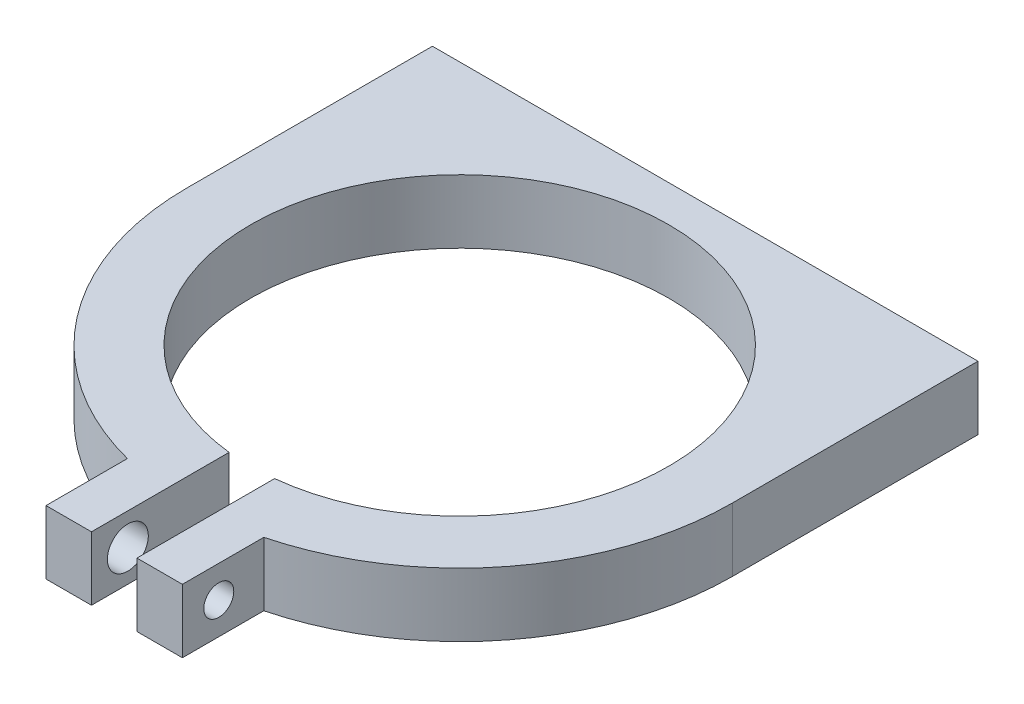
ISO-10303-21;
HEADER;
FILE_DESCRIPTION(('STEP AP214'),'2;1');
FILE_NAME('part.step','',(''),(''),'','','');
FILE_SCHEMA(('AUTOMOTIVE_DESIGN { 1 0 10303 214 1 1 1 1 }'));
ENDSEC;
DATA;
#1=APPLICATION_CONTEXT('core data for automotive mechanical design processes');
#2=APPLICATION_PROTOCOL_DEFINITION('international standard','automotive_design',2000,#1);
#3=PRODUCT_CONTEXT('',#1,'mechanical');
#4=PRODUCT('Part','Part','',(#3));
#5=PRODUCT_RELATED_PRODUCT_CATEGORY('part','',(#4));
#6=PRODUCT_DEFINITION_FORMATION('','',#4);
#7=PRODUCT_DEFINITION_CONTEXT('part definition',#1,'design');
#8=PRODUCT_DEFINITION('design','',#6,#7);
#9=PRODUCT_DEFINITION_SHAPE('','',#8);
#10=(LENGTH_UNIT() NAMED_UNIT(*) SI_UNIT(.MILLI.,.METRE.));
#11=(NAMED_UNIT(*) PLANE_ANGLE_UNIT() SI_UNIT($,.RADIAN.));
#12=(NAMED_UNIT(*) SI_UNIT($,.STERADIAN.) SOLID_ANGLE_UNIT());
#13=UNCERTAINTY_MEASURE_WITH_UNIT(LENGTH_MEASURE(1.E-05),#10,'distance_accuracy_value','');
#14=(GEOMETRIC_REPRESENTATION_CONTEXT(3) GLOBAL_UNCERTAINTY_ASSIGNED_CONTEXT((#13)) GLOBAL_UNIT_ASSIGNED_CONTEXT((#10,
#11,#12)) REPRESENTATION_CONTEXT('',''));
#15=CARTESIAN_POINT('',(0.,0.,0.));
#16=DIRECTION('',(0.,0.,1.));
#17=DIRECTION('',(1.,0.,0.));
#18=AXIS2_PLACEMENT_3D('',#15,#16,#17);
#19=CARTESIAN_POINT('',(0.,3.5,0.));
#20=DIRECTION('',(0.,-1.,0.));
#21=DIRECTION('',(0.,0.,-1.));
#22=AXIS2_PLACEMENT_3D('',#19,#20,#21);
#23=CYLINDRICAL_SURFACE('',#22,30.);
#24=CARTESIAN_POINT('',(0.,-3.5,0.));
#25=DIRECTION('',(0.,1.,0.));
#26=DIRECTION('',(0.,0.,1.));
#27=AXIS2_PLACEMENT_3D('',#24,#25,#26);
#28=CIRCLE('',#27,30.);
#29=CARTESIAN_POINT('',(-30.,-3.5,0.));
#30=VERTEX_POINT('',#29);
#31=CARTESIAN_POINT('',(-7.5,-3.5,29.0473750965556));
#32=VERTEX_POINT('',#31);
#33=EDGE_CURVE('E165',#30,#32,#28,.T.);
#34=ORIENTED_EDGE('',*,*,#33,.T.);
#35=DIRECTION('',(0.,-1.,0.));
#36=VECTOR('',#35,1.);
#37=CARTESIAN_POINT('',(-7.5,3.5,29.0473750965556));
#38=LINE('',#37,#36);
#39=CARTESIAN_POINT('',(-7.5,3.5,29.0473750965556));
#40=VERTEX_POINT('',#39);
#41=EDGE_CURVE('E11',#40,#32,#38,.T.);
#42=ORIENTED_EDGE('',*,*,#41,.F.);
#43=CARTESIAN_POINT('',(0.,3.5,0.));
#44=DIRECTION('',(0.,1.,0.));
#45=DIRECTION('',(0.,0.,1.));
#46=AXIS2_PLACEMENT_3D('',#43,#44,#45);
#47=CIRCLE('',#46,30.);
#48=CARTESIAN_POINT('',(-30.,3.5,0.));
#49=VERTEX_POINT('',#48);
#50=EDGE_CURVE('E188',#49,#40,#47,.T.);
#51=ORIENTED_EDGE('',*,*,#50,.F.);
#52=DIRECTION('',(0.,-1.,0.));
#53=VECTOR('',#52,1.);
#54=CARTESIAN_POINT('',(-30.,3.5,0.));
#55=LINE('',#54,#53);
#56=EDGE_CURVE('E161',#49,#30,#55,.T.);
#57=ORIENTED_EDGE('',*,*,#56,.T.);
#58=EDGE_LOOP('',(#34,#42,#51,#57));
#59=FACE_BOUND('',#58,.T.);
#60=ADVANCED_FACE('F42',(#59),#23,.T.);
#61=CARTESIAN_POINT('',(-7.5,3.5,38.));
#62=DIRECTION('',(1.,0.,0.));
#63=DIRECTION('',(0.,0.,-1.));
#64=AXIS2_PLACEMENT_3D('',#61,#62,#63);
#65=PLANE('',#64);
#66=CARTESIAN_POINT('',(-7.49999999999999,0.,34.));
#67=DIRECTION('',(-1.,0.,0.));
#68=DIRECTION('',(0.,0.,1.));
#69=AXIS2_PLACEMENT_3D('',#66,#67,#68);
#70=CIRCLE('',#69,2.25);
#71=CARTESIAN_POINT('',(-7.49999999999999,0.,36.25));
#72=VERTEX_POINT('',#71);
#73=EDGE_CURVE('E443',#72,#72,#70,.T.);
#74=ORIENTED_EDGE('',*,*,#73,.F.);
#75=EDGE_LOOP('',(#74));
#76=FACE_BOUND('',#75,.T.);
#77=DIRECTION('',(0.,0.,1.));
#78=VECTOR('',#77,1.);
#79=CARTESIAN_POINT('',(-7.5,-3.5,38.));
#80=LINE('',#79,#78);
#81=CARTESIAN_POINT('',(-7.5,-3.5,38.));
#82=VERTEX_POINT('',#81);
#83=EDGE_CURVE('E168',#32,#82,#80,.T.);
#84=ORIENTED_EDGE('',*,*,#83,.T.);
#85=DIRECTION('',(0.,-1.,0.));
#86=VECTOR('',#85,1.);
#87=CARTESIAN_POINT('',(-7.5,3.5,38.));
#88=LINE('',#87,#86);
#89=CARTESIAN_POINT('',(-7.5,3.5,38.));
#90=VERTEX_POINT('',#89);
#91=EDGE_CURVE('E50',#90,#82,#88,.T.);
#92=ORIENTED_EDGE('',*,*,#91,.F.);
#93=DIRECTION('',(0.,0.,1.));
#94=VECTOR('',#93,1.);
#95=CARTESIAN_POINT('',(-7.5,3.5,38.));
#96=LINE('',#95,#94);
#97=EDGE_CURVE('E114',#40,#90,#96,.T.);
#98=ORIENTED_EDGE('',*,*,#97,.F.);
#99=ORIENTED_EDGE('',*,*,#41,.T.);
#100=EDGE_LOOP('',(#84,#92,#98,#99));
#101=FACE_BOUND('',#100,.T.);
#102=ADVANCED_FACE('F267',(#76,#101),#65,.F.);
#103=CARTESIAN_POINT('',(-2.5,3.5,38.));
#104=DIRECTION('',(0.,0.,-1.));
#105=DIRECTION('',(-1.,0.,0.));
#106=AXIS2_PLACEMENT_3D('',#103,#104,#105);
#107=PLANE('',#106);
#108=DIRECTION('',(1.,0.,0.));
#109=VECTOR('',#108,1.);
#110=CARTESIAN_POINT('',(-2.5,-3.5,38.));
#111=LINE('',#110,#109);
#112=CARTESIAN_POINT('',(-2.5,-3.5,38.));
#113=VERTEX_POINT('',#112);
#114=EDGE_CURVE('E171',#82,#113,#111,.T.);
#115=ORIENTED_EDGE('',*,*,#114,.T.);
#116=DIRECTION('',(0.,-1.,0.));
#117=VECTOR('',#116,1.);
#118=CARTESIAN_POINT('',(-2.5,3.5,38.));
#119=LINE('',#118,#117);
#120=CARTESIAN_POINT('',(-2.5,3.5,38.));
#121=VERTEX_POINT('',#120);
#122=EDGE_CURVE('E207',#121,#113,#119,.T.);
#123=ORIENTED_EDGE('',*,*,#122,.F.);
#124=DIRECTION('',(1.,0.,0.));
#125=VECTOR('',#124,1.);
#126=CARTESIAN_POINT('',(-2.5,3.5,38.));
#127=LINE('',#126,#125);
#128=EDGE_CURVE('E215',#90,#121,#127,.T.);
#129=ORIENTED_EDGE('',*,*,#128,.F.);
#130=ORIENTED_EDGE('',*,*,#91,.T.);
#131=EDGE_LOOP('',(#115,#123,#129,#130));
#132=FACE_BOUND('',#131,.T.);
#133=ADVANCED_FACE('F213',(#132),#107,.F.);
#134=CARTESIAN_POINT('',(-2.5,3.5,22.8637267303474));
#135=DIRECTION('',(-1.,0.,0.));
#136=DIRECTION('',(0.,0.,1.));
#137=AXIS2_PLACEMENT_3D('',#134,#135,#136);
#138=PLANE('',#137);
#139=CARTESIAN_POINT('',(-2.5,0.,34.));
#140=DIRECTION('',(-1.,0.,0.));
#141=DIRECTION('',(0.,0.,1.));
#142=AXIS2_PLACEMENT_3D('',#139,#140,#141);
#143=CIRCLE('',#142,2.25);
#144=CARTESIAN_POINT('',(-2.49999999999999,0.,36.25));
#145=VERTEX_POINT('',#144);
#146=EDGE_CURVE('E446',#145,#145,#143,.F.);
#147=ORIENTED_EDGE('',*,*,#146,.F.);
#148=EDGE_LOOP('',(#147));
#149=FACE_BOUND('',#148,.T.);
#150=DIRECTION('',(0.,0.,-1.));
#151=VECTOR('',#150,1.);
#152=CARTESIAN_POINT('',(-2.5,-3.5,22.8637267303474));
#153=LINE('',#152,#151);
#154=CARTESIAN_POINT('',(-2.50000000000001,-3.5,22.8637267303474));
#155=VERTEX_POINT('',#154);
#156=EDGE_CURVE('E173',#113,#155,#153,.T.);
#157=ORIENTED_EDGE('',*,*,#156,.T.);
#158=DIRECTION('',(0.,-1.,0.));
#159=VECTOR('',#158,1.);
#160=CARTESIAN_POINT('',(-2.50000000000001,3.5,22.8637267303474));
#161=LINE('',#160,#159);
#162=CARTESIAN_POINT('',(-2.50000000000001,3.5,22.8637267303474));
#163=VERTEX_POINT('',#162);
#164=EDGE_CURVE('E204',#163,#155,#161,.T.);
#165=ORIENTED_EDGE('',*,*,#164,.F.);
#166=DIRECTION('',(0.,0.,-1.));
#167=VECTOR('',#166,1.);
#168=CARTESIAN_POINT('',(-2.5,3.5,22.8637267303474));
#169=LINE('',#168,#167);
#170=EDGE_CURVE('E233',#121,#163,#169,.T.);
#171=ORIENTED_EDGE('',*,*,#170,.F.);
#172=ORIENTED_EDGE('',*,*,#122,.T.);
#173=EDGE_LOOP('',(#157,#165,#171,#172));
#174=FACE_BOUND('',#173,.T.);
#175=ADVANCED_FACE('F224',(#149,#174),#138,.F.);
#176=CARTESIAN_POINT('',(0.,3.5,0.));
#177=DIRECTION('',(0.,-1.,0.));
#178=DIRECTION('',(0.,0.,-1.));
#179=AXIS2_PLACEMENT_3D('',#176,#177,#178);
#180=CYLINDRICAL_SURFACE('',#179,23.);
#181=CARTESIAN_POINT('',(0.,-3.5,0.));
#182=DIRECTION('',(0.,-1.,0.));
#183=DIRECTION('',(0.,0.,1.));
#184=AXIS2_PLACEMENT_3D('',#181,#182,#183);
#185=CIRCLE('',#184,23.);
#186=CARTESIAN_POINT('',(2.49999999999998,-3.5,22.8637267303474));
#187=VERTEX_POINT('',#186);
#188=EDGE_CURVE('E175',#155,#187,#185,.T.);
#189=ORIENTED_EDGE('',*,*,#188,.T.);
#190=DIRECTION('',(0.,-1.,0.));
#191=VECTOR('',#190,1.);
#192=CARTESIAN_POINT('',(2.49999999999998,3.5,22.8637267303474));
#193=LINE('',#192,#191);
#194=CARTESIAN_POINT('',(2.49999999999998,3.5,22.8637267303474));
#195=VERTEX_POINT('',#194);
#196=EDGE_CURVE('E201',#195,#187,#193,.T.);
#197=ORIENTED_EDGE('',*,*,#196,.F.);
#198=CARTESIAN_POINT('',(0.,3.5,0.));
#199=DIRECTION('',(0.,-1.,0.));
#200=DIRECTION('',(0.,0.,1.));
#201=AXIS2_PLACEMENT_3D('',#198,#199,#200);
#202=CIRCLE('',#201,23.);
#203=EDGE_CURVE('E230',#163,#195,#202,.T.);
#204=ORIENTED_EDGE('',*,*,#203,.F.);
#205=ORIENTED_EDGE('',*,*,#164,.T.);
#206=EDGE_LOOP('',(#189,#197,#204,#205));
#207=FACE_BOUND('',#206,.T.);
#208=ADVANCED_FACE('F228',(#207),#180,.F.);
#209=CARTESIAN_POINT('',(2.49999999999998,3.5,22.8637267303474));
#210=DIRECTION('',(1.,0.,0.));
#211=DIRECTION('',(0.,0.,-1.));
#212=AXIS2_PLACEMENT_3D('',#209,#210,#211);
#213=PLANE('',#212);
#214=CARTESIAN_POINT('',(2.49999999999994,0.,34.));
#215=DIRECTION('',(1.,0.,0.));
#216=DIRECTION('',(0.,0.,-1.));
#217=AXIS2_PLACEMENT_3D('',#214,#215,#216);
#218=CIRCLE('',#217,1.65);
#219=CARTESIAN_POINT('',(2.49999999999995,0.,32.35));
#220=VERTEX_POINT('',#219);
#221=EDGE_CURVE('E452',#220,#220,#218,.T.);
#222=ORIENTED_EDGE('',*,*,#221,.T.);
#223=EDGE_LOOP('',(#222));
#224=FACE_BOUND('',#223,.T.);
#225=DIRECTION('',(0.,0.,1.));
#226=VECTOR('',#225,1.);
#227=CARTESIAN_POINT('',(2.49999999999998,-3.5,22.8637267303474));
#228=LINE('',#227,#226);
#229=CARTESIAN_POINT('',(2.49999999999992,-3.5,38.));
#230=VERTEX_POINT('',#229);
#231=EDGE_CURVE('E177',#187,#230,#228,.T.);
#232=ORIENTED_EDGE('',*,*,#231,.T.);
#233=DIRECTION('',(0.,-1.,0.));
#234=VECTOR('',#233,1.);
#235=CARTESIAN_POINT('',(2.49999999999992,3.5,38.));
#236=LINE('',#235,#234);
#237=CARTESIAN_POINT('',(2.49999999999992,3.5,38.));
#238=VERTEX_POINT('',#237);
#239=EDGE_CURVE('E198',#238,#230,#236,.T.);
#240=ORIENTED_EDGE('',*,*,#239,.F.);
#241=DIRECTION('',(0.,0.,1.));
#242=VECTOR('',#241,1.);
#243=CARTESIAN_POINT('',(2.49999999999998,3.5,22.8637267303474));
#244=LINE('',#243,#242);
#245=EDGE_CURVE('E232',#195,#238,#244,.T.);
#246=ORIENTED_EDGE('',*,*,#245,.F.);
#247=ORIENTED_EDGE('',*,*,#196,.T.);
#248=EDGE_LOOP('',(#232,#240,#246,#247));
#249=FACE_BOUND('',#248,.T.);
#250=ADVANCED_FACE('F283',(#224,#249),#213,.F.);
#251=CARTESIAN_POINT('',(2.49999999999992,3.5,38.));
#252=DIRECTION('',(0.,0.,-1.));
#253=DIRECTION('',(-1.,0.,0.));
#254=AXIS2_PLACEMENT_3D('',#251,#252,#253);
#255=PLANE('',#254);
#256=DIRECTION('',(1.,0.,0.));
#257=VECTOR('',#256,1.);
#258=CARTESIAN_POINT('',(2.49999999999992,-3.5,38.));
#259=LINE('',#258,#257);
#260=CARTESIAN_POINT('',(7.49999999999992,-3.5,38.));
#261=VERTEX_POINT('',#260);
#262=EDGE_CURVE('E179',#230,#261,#259,.T.);
#263=ORIENTED_EDGE('',*,*,#262,.T.);
#264=DIRECTION('',(0.,-1.,0.));
#265=VECTOR('',#264,1.);
#266=CARTESIAN_POINT('',(7.49999999999992,3.5,38.));
#267=LINE('',#266,#265);
#268=CARTESIAN_POINT('',(7.49999999999992,3.5,38.));
#269=VERTEX_POINT('',#268);
#270=EDGE_CURVE('E195',#269,#261,#267,.T.);
#271=ORIENTED_EDGE('',*,*,#270,.F.);
#272=DIRECTION('',(1.,0.,0.));
#273=VECTOR('',#272,1.);
#274=CARTESIAN_POINT('',(2.49999999999992,3.5,38.));
#275=LINE('',#274,#273);
#276=EDGE_CURVE('E235',#238,#269,#275,.T.);
#277=ORIENTED_EDGE('',*,*,#276,.F.);
#278=ORIENTED_EDGE('',*,*,#239,.T.);
#279=EDGE_LOOP('',(#263,#271,#277,#278));
#280=FACE_BOUND('',#279,.T.);
#281=ADVANCED_FACE('F286',(#280),#255,.F.);
#282=CARTESIAN_POINT('',(7.49999999999992,3.5,38.));
#283=DIRECTION('',(-1.,0.,0.));
#284=DIRECTION('',(0.,0.,1.));
#285=AXIS2_PLACEMENT_3D('',#282,#283,#284);
#286=PLANE('',#285);
#287=CARTESIAN_POINT('',(7.50000000000025,0.,34.));
#288=DIRECTION('',(1.,0.,0.));
#289=DIRECTION('',(0.,0.,-1.));
#290=AXIS2_PLACEMENT_3D('',#287,#288,#289);
#291=CIRCLE('',#290,1.65);
#292=CARTESIAN_POINT('',(7.50000000000027,0.,32.35));
#293=VERTEX_POINT('',#292);
#294=EDGE_CURVE('E475',#293,#293,#291,.T.);
#295=ORIENTED_EDGE('',*,*,#294,.F.);
#296=EDGE_LOOP('',(#295));
#297=FACE_BOUND('',#296,.T.);
#298=DIRECTION('',(0.,0.,-1.));
#299=VECTOR('',#298,1.);
#300=CARTESIAN_POINT('',(7.49999999999992,-3.5,38.));
#301=LINE('',#300,#299);
#302=CARTESIAN_POINT('',(7.5,-3.5,29.0473750965556));
#303=VERTEX_POINT('',#302);
#304=EDGE_CURVE('E181',#261,#303,#301,.T.);
#305=ORIENTED_EDGE('',*,*,#304,.T.);
#306=DIRECTION('',(0.,-1.,0.));
#307=VECTOR('',#306,1.);
#308=CARTESIAN_POINT('',(7.5,3.5,29.0473750965556));
#309=LINE('',#308,#307);
#310=CARTESIAN_POINT('',(7.5,3.5,29.0473750965556));
#311=VERTEX_POINT('',#310);
#312=EDGE_CURVE('E192',#311,#303,#309,.T.);
#313=ORIENTED_EDGE('',*,*,#312,.F.);
#314=DIRECTION('',(0.,0.,-1.));
#315=VECTOR('',#314,1.);
#316=CARTESIAN_POINT('',(7.49999999999992,3.5,38.));
#317=LINE('',#316,#315);
#318=EDGE_CURVE('E241',#269,#311,#317,.T.);
#319=ORIENTED_EDGE('',*,*,#318,.F.);
#320=ORIENTED_EDGE('',*,*,#270,.T.);
#321=EDGE_LOOP('',(#305,#313,#319,#320));
#322=FACE_BOUND('',#321,.T.);
#323=ADVANCED_FACE('F247',(#297,#322),#286,.F.);
#324=CARTESIAN_POINT('',(0.,3.5,0.));
#325=DIRECTION('',(0.,-1.,0.));
#326=DIRECTION('',(0.,0.,-1.));
#327=AXIS2_PLACEMENT_3D('',#324,#325,#326);
#328=CYLINDRICAL_SURFACE('',#327,30.);
#329=CARTESIAN_POINT('',(0.,-3.5,0.));
#330=DIRECTION('',(0.,1.,0.));
#331=DIRECTION('',(0.,0.,1.));
#332=AXIS2_PLACEMENT_3D('',#329,#330,#331);
#333=CIRCLE('',#332,30.);
#334=CARTESIAN_POINT('',(30.,-3.5,0.));
#335=VERTEX_POINT('',#334);
#336=EDGE_CURVE('E183',#303,#335,#333,.T.);
#337=ORIENTED_EDGE('',*,*,#336,.T.);
#338=DIRECTION('',(0.,-1.,0.));
#339=VECTOR('',#338,1.);
#340=CARTESIAN_POINT('',(30.,3.5,0.));
#341=LINE('',#340,#339);
#342=CARTESIAN_POINT('',(30.,3.5,0.));
#343=VERTEX_POINT('',#342);
#344=EDGE_CURVE('E156',#343,#335,#341,.T.);
#345=ORIENTED_EDGE('',*,*,#344,.F.);
#346=CARTESIAN_POINT('',(0.,3.5,0.));
#347=DIRECTION('',(0.,1.,0.));
#348=DIRECTION('',(0.,0.,1.));
#349=AXIS2_PLACEMENT_3D('',#346,#347,#348);
#350=CIRCLE('',#349,30.);
#351=EDGE_CURVE('E147',#311,#343,#350,.T.);
#352=ORIENTED_EDGE('',*,*,#351,.F.);
#353=ORIENTED_EDGE('',*,*,#312,.T.);
#354=EDGE_LOOP('',(#337,#345,#352,#353));
#355=FACE_BOUND('',#354,.T.);
#356=ADVANCED_FACE('F251',(#355),#328,.T.);
#357=CARTESIAN_POINT('',(30.,3.5,-27.));
#358=DIRECTION('',(-1.,0.,0.));
#359=DIRECTION('',(0.,0.,1.));
#360=AXIS2_PLACEMENT_3D('',#357,#358,#359);
#361=PLANE('',#360);
#362=DIRECTION('',(0.,0.,-1.));
#363=VECTOR('',#362,1.);
#364=CARTESIAN_POINT('',(30.,-3.5,-27.));
#365=LINE('',#364,#363);
#366=CARTESIAN_POINT('',(30.,-3.5,-27.));
#367=VERTEX_POINT('',#366);
#368=EDGE_CURVE('E155',#335,#367,#365,.T.);
#369=ORIENTED_EDGE('',*,*,#368,.T.);
#370=DIRECTION('',(0.,-1.,0.));
#371=VECTOR('',#370,1.);
#372=CARTESIAN_POINT('',(30.,3.5,-27.));
#373=LINE('',#372,#371);
#374=CARTESIAN_POINT('',(30.,3.5,-27.));
#375=VERTEX_POINT('',#374);
#376=EDGE_CURVE('E152',#375,#367,#373,.T.);
#377=ORIENTED_EDGE('',*,*,#376,.F.);
#378=DIRECTION('',(0.,0.,-1.));
#379=VECTOR('',#378,1.);
#380=CARTESIAN_POINT('',(30.,3.5,-27.));
#381=LINE('',#380,#379);
#382=EDGE_CURVE('E141',#343,#375,#381,.T.);
#383=ORIENTED_EDGE('',*,*,#382,.F.);
#384=ORIENTED_EDGE('',*,*,#344,.T.);
#385=EDGE_LOOP('',(#369,#377,#383,#384));
#386=FACE_BOUND('',#385,.T.);
#387=ADVANCED_FACE('F153',(#386),#361,.F.);
#388=CARTESIAN_POINT('',(-30.,3.5,-27.));
#389=DIRECTION('',(0.,0.,1.));
#390=DIRECTION('',(1.,0.,0.));
#391=AXIS2_PLACEMENT_3D('',#388,#389,#390);
#392=PLANE('',#391);
#393=CARTESIAN_POINT('',(-24.75,0.,-27.));
#394=DIRECTION('',(0.,0.,-1.));
#395=DIRECTION('',(-1.,0.,0.));
#396=AXIS2_PLACEMENT_3D('',#393,#394,#395);
#397=CIRCLE('',#396,1.65);
#398=CARTESIAN_POINT('',(-26.4,0.,-27.));
#399=VERTEX_POINT('',#398);
#400=EDGE_CURVE('E447',#399,#399,#397,.T.);
#401=ORIENTED_EDGE('',*,*,#400,.F.);
#402=EDGE_LOOP('',(#401));
#403=FACE_BOUND('',#402,.T.);
#404=CARTESIAN_POINT('',(24.75,0.,-27.));
#405=DIRECTION('',(0.,0.,-1.));
#406=DIRECTION('',(-1.,0.,0.));
#407=AXIS2_PLACEMENT_3D('',#404,#405,#406);
#408=CIRCLE('',#407,1.65);
#409=CARTESIAN_POINT('',(23.1,0.,-27.));
#410=VERTEX_POINT('',#409);
#411=EDGE_CURVE('E459',#410,#410,#408,.T.);
#412=ORIENTED_EDGE('',*,*,#411,.F.);
#413=EDGE_LOOP('',(#412));
#414=FACE_BOUND('',#413,.T.);
#415=DIRECTION('',(-1.,0.,0.));
#416=VECTOR('',#415,1.);
#417=CARTESIAN_POINT('',(-30.,-3.5,-27.));
#418=LINE('',#417,#416);
#419=CARTESIAN_POINT('',(-30.,-3.5,-27.));
#420=VERTEX_POINT('',#419);
#421=EDGE_CURVE('E100',#367,#420,#418,.T.);
#422=ORIENTED_EDGE('',*,*,#421,.T.);
#423=DIRECTION('',(0.,-1.,0.));
#424=VECTOR('',#423,1.);
#425=CARTESIAN_POINT('',(-30.,3.5,-27.));
#426=LINE('',#425,#424);
#427=CARTESIAN_POINT('',(-30.,3.5,-27.));
#428=VERTEX_POINT('',#427);
#429=EDGE_CURVE('E157',#428,#420,#426,.T.);
#430=ORIENTED_EDGE('',*,*,#429,.F.);
#431=DIRECTION('',(-1.,0.,0.));
#432=VECTOR('',#431,1.);
#433=CARTESIAN_POINT('',(-30.,3.5,-27.));
#434=LINE('',#433,#432);
#435=EDGE_CURVE('E145',#375,#428,#434,.T.);
#436=ORIENTED_EDGE('',*,*,#435,.F.);
#437=ORIENTED_EDGE('',*,*,#376,.T.);
#438=EDGE_LOOP('',(#422,#430,#436,#437));
#439=FACE_BOUND('',#438,.T.);
#440=ADVANCED_FACE('F159',(#403,#414,#439),#392,.F.);
#441=CARTESIAN_POINT('',(-30.,3.5,0.));
#442=DIRECTION('',(1.,0.,0.));
#443=DIRECTION('',(0.,0.,-1.));
#444=AXIS2_PLACEMENT_3D('',#441,#442,#443);
#445=PLANE('',#444);
#446=DIRECTION('',(0.,0.,1.));
#447=VECTOR('',#446,1.);
#448=CARTESIAN_POINT('',(-30.,-3.5,0.));
#449=LINE('',#448,#447);
#450=EDGE_CURVE('E106',#420,#30,#449,.T.);
#451=ORIENTED_EDGE('',*,*,#450,.T.);
#452=ORIENTED_EDGE('',*,*,#56,.F.);
#453=DIRECTION('',(0.,0.,1.));
#454=VECTOR('',#453,1.);
#455=CARTESIAN_POINT('',(-30.,3.5,0.));
#456=LINE('',#455,#454);
#457=EDGE_CURVE('E58',#428,#49,#456,.T.);
#458=ORIENTED_EDGE('',*,*,#457,.F.);
#459=ORIENTED_EDGE('',*,*,#429,.T.);
#460=EDGE_LOOP('',(#451,#452,#458,#459));
#461=FACE_BOUND('',#460,.T.);
#462=ADVANCED_FACE('F255',(#461),#445,.F.);
#463=CARTESIAN_POINT('',(0.,3.5,0.));
#464=DIRECTION('',(0.,1.,0.));
#465=DIRECTION('',(0.,0.,1.));
#466=AXIS2_PLACEMENT_3D('',#463,#464,#465);
#467=PLANE('',#466);
#468=ORIENTED_EDGE('',*,*,#50,.T.);
#469=ORIENTED_EDGE('',*,*,#97,.T.);
#470=ORIENTED_EDGE('',*,*,#128,.T.);
#471=ORIENTED_EDGE('',*,*,#170,.T.);
#472=ORIENTED_EDGE('',*,*,#203,.T.);
#473=ORIENTED_EDGE('',*,*,#245,.T.);
#474=ORIENTED_EDGE('',*,*,#276,.T.);
#475=ORIENTED_EDGE('',*,*,#318,.T.);
#476=ORIENTED_EDGE('',*,*,#351,.T.);
#477=ORIENTED_EDGE('',*,*,#382,.T.);
#478=ORIENTED_EDGE('',*,*,#435,.T.);
#479=ORIENTED_EDGE('',*,*,#457,.T.);
#480=EDGE_LOOP('',(#468,#469,#470,#471,#472,#473,#474,#475,#476,#477,#478,#479));
#481=FACE_BOUND('',#480,.T.);
#482=ADVANCED_FACE('F143',(#481),#467,.T.);
#483=CARTESIAN_POINT('',(0.,-3.5,0.));
#484=DIRECTION('',(0.,1.,0.));
#485=DIRECTION('',(0.,0.,1.));
#486=AXIS2_PLACEMENT_3D('',#483,#484,#485);
#487=PLANE('',#486);
#488=ORIENTED_EDGE('',*,*,#33,.F.);
#489=ORIENTED_EDGE('',*,*,#450,.F.);
#490=ORIENTED_EDGE('',*,*,#421,.F.);
#491=ORIENTED_EDGE('',*,*,#368,.F.);
#492=ORIENTED_EDGE('',*,*,#336,.F.);
#493=ORIENTED_EDGE('',*,*,#304,.F.);
#494=ORIENTED_EDGE('',*,*,#262,.F.);
#495=ORIENTED_EDGE('',*,*,#231,.F.);
#496=ORIENTED_EDGE('',*,*,#188,.F.);
#497=ORIENTED_EDGE('',*,*,#156,.F.);
#498=ORIENTED_EDGE('',*,*,#114,.F.);
#499=ORIENTED_EDGE('',*,*,#83,.F.);
#500=EDGE_LOOP('',(#488,#489,#490,#491,#492,#493,#494,#495,#496,#497,#498,#499));
#501=FACE_BOUND('',#500,.T.);
#502=ADVANCED_FACE('F219',(#501),#487,.F.);
#503=CARTESIAN_POINT('',(24.75,0.,-17.9914200213955));
#504=DIRECTION('',(0.,0.,-1.));
#505=DIRECTION('',(-1.,0.,0.));
#506=AXIS2_PLACEMENT_3D('',#503,#504,#505);
#507=CONICAL_SURFACE('',#506,1.65,1.02974425867665);
#508=CARTESIAN_POINT('',(24.75,0.,-17.));
#509=VERTEX_POINT('',#508);
#510=VERTEX_LOOP('',#509);
#511=FACE_BOUND('',#510,.T.);
#512=CARTESIAN_POINT('',(24.75,0.,-17.9914200213955));
#513=DIRECTION('',(0.,0.,-1.));
#514=DIRECTION('',(-1.,0.,0.));
#515=AXIS2_PLACEMENT_3D('',#512,#513,#514);
#516=CIRCLE('',#515,1.65);
#517=CARTESIAN_POINT('',(23.1,0.,-17.9914200213955));
#518=VERTEX_POINT('',#517);
#519=EDGE_CURVE('E169',#518,#518,#516,.T.);
#520=ORIENTED_EDGE('',*,*,#519,.T.);
#521=EDGE_LOOP('',(#520));
#522=FACE_BOUND('',#521,.T.);
#523=ADVANCED_FACE('F318',(#511,#522),#507,.F.);
#524=CARTESIAN_POINT('',(24.75,0.,-27.));
#525=DIRECTION('',(0.,0.,-1.));
#526=DIRECTION('',(-1.,0.,0.));
#527=AXIS2_PLACEMENT_3D('',#524,#525,#526);
#528=CYLINDRICAL_SURFACE('',#527,1.65);
#529=ORIENTED_EDGE('',*,*,#519,.F.);
#530=EDGE_LOOP('',(#529));
#531=FACE_BOUND('',#530,.T.);
#532=ORIENTED_EDGE('',*,*,#411,.T.);
#533=EDGE_LOOP('',(#532));
#534=FACE_BOUND('',#533,.T.);
#535=ADVANCED_FACE('F311',(#531,#534),#528,.F.);
#536=CARTESIAN_POINT('',(-24.75,0.,-17.9914200213955));
#537=DIRECTION('',(0.,0.,-1.));
#538=DIRECTION('',(-1.,0.,0.));
#539=AXIS2_PLACEMENT_3D('',#536,#537,#538);
#540=CONICAL_SURFACE('',#539,1.65,1.02974425867665);
#541=CARTESIAN_POINT('',(-24.75,0.,-17.));
#542=VERTEX_POINT('',#541);
#543=VERTEX_LOOP('',#542);
#544=FACE_BOUND('',#543,.T.);
#545=CARTESIAN_POINT('',(-24.75,0.,-17.9914200213955));
#546=DIRECTION('',(0.,0.,-1.));
#547=DIRECTION('',(-1.,0.,0.));
#548=AXIS2_PLACEMENT_3D('',#545,#546,#547);
#549=CIRCLE('',#548,1.65);
#550=CARTESIAN_POINT('',(-26.4,0.,-17.9914200213955));
#551=VERTEX_POINT('',#550);
#552=EDGE_CURVE('E450',#551,#551,#549,.T.);
#553=ORIENTED_EDGE('',*,*,#552,.T.);
#554=EDGE_LOOP('',(#553));
#555=FACE_BOUND('',#554,.T.);
#556=ADVANCED_FACE('F317',(#544,#555),#540,.F.);
#557=CARTESIAN_POINT('',(-24.75,0.,-27.));
#558=DIRECTION('',(0.,0.,-1.));
#559=DIRECTION('',(-1.,0.,0.));
#560=AXIS2_PLACEMENT_3D('',#557,#558,#559);
#561=CYLINDRICAL_SURFACE('',#560,1.65);
#562=ORIENTED_EDGE('',*,*,#552,.F.);
#563=EDGE_LOOP('',(#562));
#564=FACE_BOUND('',#563,.T.);
#565=ORIENTED_EDGE('',*,*,#400,.T.);
#566=EDGE_LOOP('',(#565));
#567=FACE_BOUND('',#566,.T.);
#568=ADVANCED_FACE('F326',(#564,#567),#561,.F.);
#569=CARTESIAN_POINT('',(30.001,0.,34.));
#570=DIRECTION('',(-1.,0.,0.));
#571=DIRECTION('',(0.,0.,1.));
#572=AXIS2_PLACEMENT_3D('',#569,#570,#571);
#573=CYLINDRICAL_SURFACE('',#572,2.25);
#574=ORIENTED_EDGE('',*,*,#73,.T.);
#575=EDGE_LOOP('',(#574));
#576=FACE_BOUND('',#575,.T.);
#577=ORIENTED_EDGE('',*,*,#146,.T.);
#578=EDGE_LOOP('',(#577));
#579=FACE_BOUND('',#578,.T.);
#580=ADVANCED_FACE('F330',(#576,#579),#573,.F.);
#581=CARTESIAN_POINT('',(7.50000000000025,0.,34.));
#582=DIRECTION('',(1.,0.,0.));
#583=DIRECTION('',(0.,0.,-1.));
#584=AXIS2_PLACEMENT_3D('',#581,#582,#583);
#585=CYLINDRICAL_SURFACE('',#584,1.65);
#586=ORIENTED_EDGE('',*,*,#294,.T.);
#587=EDGE_LOOP('',(#586));
#588=FACE_BOUND('',#587,.T.);
#589=ORIENTED_EDGE('',*,*,#221,.F.);
#590=EDGE_LOOP('',(#589));
#591=FACE_BOUND('',#590,.T.);
#592=ADVANCED_FACE('F336',(#588,#591),#585,.F.);
#593=CLOSED_SHELL('',(#60,#102,#133,#175,#208,#250,#281,#323,#356,#387,#440,#462,#482,#502,#523,
#535,#556,#568,#580,#592));
#594=MANIFOLD_SOLID_BREP('B2',#593);
#595=ADVANCED_BREP_SHAPE_REPRESENTATION('',(#18,#594),#14);
#596=SHAPE_DEFINITION_REPRESENTATION(#9,#595);
ENDSEC;
END-ISO-10303-21;
